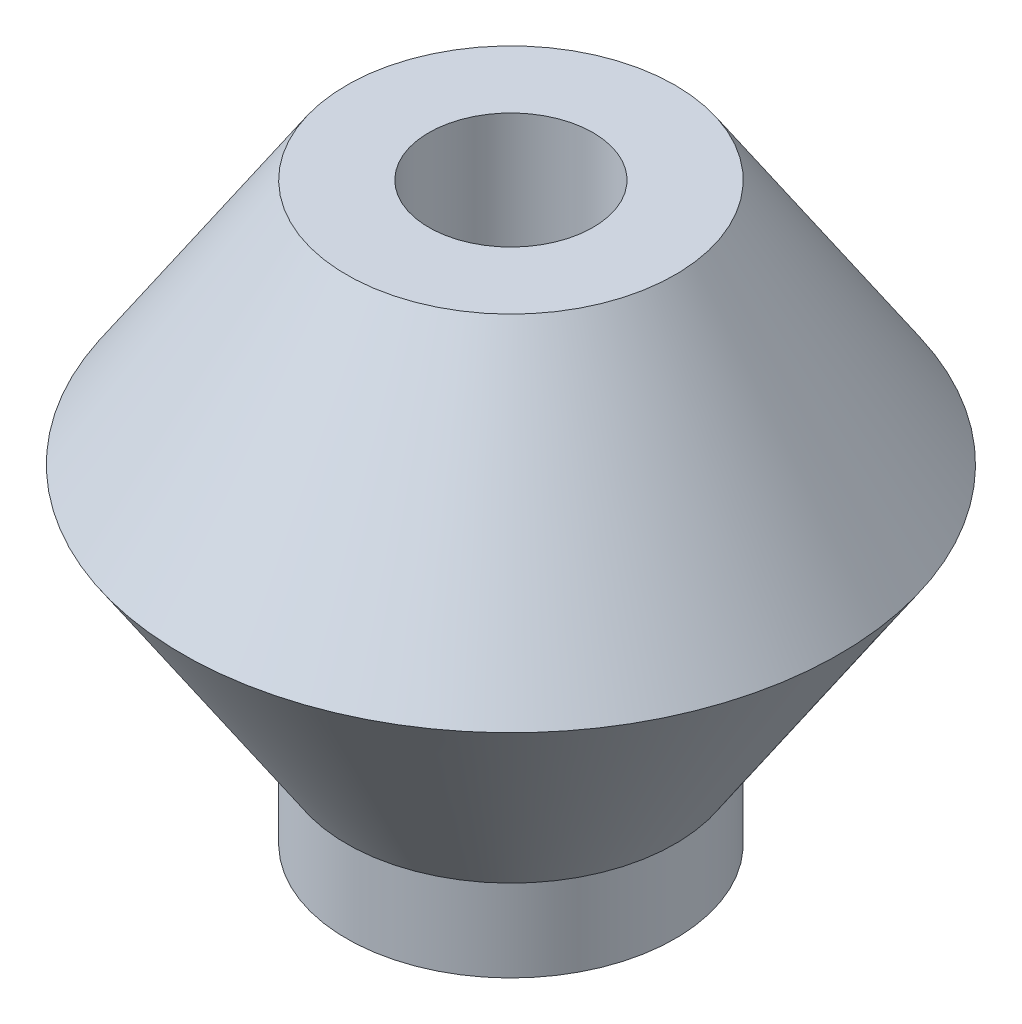
ISO-10303-21;
HEADER;
FILE_DESCRIPTION(('STEP AP214'),'2;1');
FILE_NAME('part.step','',(''),(''),'','','');
FILE_SCHEMA(('AUTOMOTIVE_DESIGN { 1 0 10303 214 1 1 1 1 }'));
ENDSEC;
DATA;
#1=APPLICATION_CONTEXT('core data for automotive mechanical design processes');
#2=APPLICATION_PROTOCOL_DEFINITION('international standard','automotive_design',2000,#1);
#3=PRODUCT_CONTEXT('',#1,'mechanical');
#4=PRODUCT('Part','Part','',(#3));
#5=PRODUCT_RELATED_PRODUCT_CATEGORY('part','',(#4));
#6=PRODUCT_DEFINITION_FORMATION('','',#4);
#7=PRODUCT_DEFINITION_CONTEXT('part definition',#1,'design');
#8=PRODUCT_DEFINITION('design','',#6,#7);
#9=PRODUCT_DEFINITION_SHAPE('','',#8);
#10=(LENGTH_UNIT() NAMED_UNIT(*) SI_UNIT(.MILLI.,.METRE.));
#11=(NAMED_UNIT(*) PLANE_ANGLE_UNIT() SI_UNIT($,.RADIAN.));
#12=(NAMED_UNIT(*) SI_UNIT($,.STERADIAN.) SOLID_ANGLE_UNIT());
#13=UNCERTAINTY_MEASURE_WITH_UNIT(LENGTH_MEASURE(1.E-05),#10,'distance_accuracy_value','');
#14=(GEOMETRIC_REPRESENTATION_CONTEXT(3) GLOBAL_UNCERTAINTY_ASSIGNED_CONTEXT((#13)) GLOBAL_UNIT_ASSIGNED_CONTEXT((#10,
#11,#12)) REPRESENTATION_CONTEXT('',''));
#15=CARTESIAN_POINT('',(0.,0.,0.));
#16=DIRECTION('',(0.,0.,1.));
#17=DIRECTION('',(1.,0.,0.));
#18=AXIS2_PLACEMENT_3D('',#15,#16,#17);
#19=CARTESIAN_POINT('',(4.,0.,0.));
#20=DIRECTION('',(0.,-1.,0.));
#21=DIRECTION('',(0.,0.,-1.));
#22=AXIS2_PLACEMENT_3D('',#19,#20,#21);
#23=PLANE('',#22);
#24=CARTESIAN_POINT('',(0.,0.,0.));
#25=DIRECTION('',(0.,-1.,0.));
#26=DIRECTION('',(0.,0.,-1.));
#27=AXIS2_PLACEMENT_3D('',#24,#25,#26);
#28=CIRCLE('',#27,4.);
#29=CARTESIAN_POINT('',(0.,0.,-4.));
#30=VERTEX_POINT('',#29);
#31=EDGE_CURVE('E53',#30,#30,#28,.T.);
#32=ORIENTED_EDGE('',*,*,#31,.T.);
#33=EDGE_LOOP('',(#32));
#34=FACE_BOUND('',#33,.T.);
#35=CARTESIAN_POINT('',(0.,0.,0.));
#36=DIRECTION('',(0.,-1.,0.));
#37=DIRECTION('',(0.,0.,-1.));
#38=AXIS2_PLACEMENT_3D('',#35,#36,#37);
#39=CIRCLE('',#38,2.);
#40=CARTESIAN_POINT('',(0.,0.,-2.));
#41=VERTEX_POINT('',#40);
#42=EDGE_CURVE('E10',#41,#41,#39,.T.);
#43=ORIENTED_EDGE('',*,*,#42,.F.);
#44=EDGE_LOOP('',(#43));
#45=FACE_BOUND('',#44,.T.);
#46=ADVANCED_FACE('F31',(#34,#45),#23,.T.);
#47=CARTESIAN_POINT('',(0.,0.,0.));
#48=DIRECTION('',(0.,-1.,0.));
#49=DIRECTION('',(0.,0.,-1.));
#50=AXIS2_PLACEMENT_3D('',#47,#48,#49);
#51=CYLINDRICAL_SURFACE('',#50,2.);
#52=ORIENTED_EDGE('',*,*,#42,.T.);
#53=EDGE_LOOP('',(#52));
#54=FACE_BOUND('',#53,.T.);
#55=CARTESIAN_POINT('',(0.,14.,0.));
#56=DIRECTION('',(0.,-1.,0.));
#57=DIRECTION('',(0.,0.,-1.));
#58=AXIS2_PLACEMENT_3D('',#55,#56,#57);
#59=CIRCLE('',#58,2.);
#60=CARTESIAN_POINT('',(0.,14.,-2.));
#61=VERTEX_POINT('',#60);
#62=EDGE_CURVE('E37',#61,#61,#59,.T.);
#63=ORIENTED_EDGE('',*,*,#62,.F.);
#64=EDGE_LOOP('',(#63));
#65=FACE_BOUND('',#64,.T.);
#66=ADVANCED_FACE('F71',(#54,#65),#51,.F.);
#67=CARTESIAN_POINT('',(2.,14.,0.));
#68=DIRECTION('',(0.,1.,0.));
#69=DIRECTION('',(0.,0.,1.));
#70=AXIS2_PLACEMENT_3D('',#67,#68,#69);
#71=PLANE('',#70);
#72=ORIENTED_EDGE('',*,*,#62,.T.);
#73=EDGE_LOOP('',(#72));
#74=FACE_BOUND('',#73,.T.);
#75=CARTESIAN_POINT('',(0.,14.,0.));
#76=DIRECTION('',(0.,-1.,0.));
#77=DIRECTION('',(0.,0.,-1.));
#78=AXIS2_PLACEMENT_3D('',#75,#76,#77);
#79=CIRCLE('',#78,4.);
#80=CARTESIAN_POINT('',(0.,14.,-4.));
#81=VERTEX_POINT('',#80);
#82=EDGE_CURVE('E41',#81,#81,#79,.T.);
#83=ORIENTED_EDGE('',*,*,#82,.F.);
#84=EDGE_LOOP('',(#83));
#85=FACE_BOUND('',#84,.T.);
#86=ADVANCED_FACE('F75',(#74,#85),#71,.T.);
#87=CARTESIAN_POINT('',(0.,8.,0.));
#88=DIRECTION('',(0.,-1.,0.));
#89=DIRECTION('',(0.,0.,-1.));
#90=AXIS2_PLACEMENT_3D('',#87,#88,#89);
#91=CONICAL_SURFACE('',#90,8.,0.588002603547568);
#92=ORIENTED_EDGE('',*,*,#82,.T.);
#93=EDGE_LOOP('',(#92));
#94=FACE_BOUND('',#93,.T.);
#95=CARTESIAN_POINT('',(0.,8.,0.));
#96=DIRECTION('',(0.,-1.,0.));
#97=DIRECTION('',(0.,0.,-1.));
#98=AXIS2_PLACEMENT_3D('',#95,#96,#97);
#99=CIRCLE('',#98,8.);
#100=CARTESIAN_POINT('',(0.,8.,-8.));
#101=VERTEX_POINT('',#100);
#102=EDGE_CURVE('E45',#101,#101,#99,.T.);
#103=ORIENTED_EDGE('',*,*,#102,.F.);
#104=EDGE_LOOP('',(#103));
#105=FACE_BOUND('',#104,.T.);
#106=ADVANCED_FACE('F67',(#94,#105),#91,.T.);
#107=CARTESIAN_POINT('',(0.,2.,0.));
#108=DIRECTION('',(0.,1.,0.));
#109=DIRECTION('',(0.,0.,1.));
#110=AXIS2_PLACEMENT_3D('',#107,#108,#109);
#111=CONICAL_SURFACE('',#110,4.,0.588002603547568);
#112=ORIENTED_EDGE('',*,*,#102,.T.);
#113=EDGE_LOOP('',(#112));
#114=FACE_BOUND('',#113,.T.);
#115=CARTESIAN_POINT('',(0.,2.,0.));
#116=DIRECTION('',(0.,-1.,0.));
#117=DIRECTION('',(0.,0.,-1.));
#118=AXIS2_PLACEMENT_3D('',#115,#116,#117);
#119=CIRCLE('',#118,4.);
#120=CARTESIAN_POINT('',(0.,2.,-4.));
#121=VERTEX_POINT('',#120);
#122=EDGE_CURVE('E50',#121,#121,#119,.T.);
#123=ORIENTED_EDGE('',*,*,#122,.F.);
#124=EDGE_LOOP('',(#123));
#125=FACE_BOUND('',#124,.T.);
#126=ADVANCED_FACE('F61',(#114,#125),#111,.T.);
#127=CARTESIAN_POINT('',(0.,0.,0.));
#128=DIRECTION('',(0.,-1.,0.));
#129=DIRECTION('',(0.,0.,-1.));
#130=AXIS2_PLACEMENT_3D('',#127,#128,#129);
#131=CYLINDRICAL_SURFACE('',#130,4.);
#132=ORIENTED_EDGE('',*,*,#122,.T.);
#133=EDGE_LOOP('',(#132));
#134=FACE_BOUND('',#133,.T.);
#135=ORIENTED_EDGE('',*,*,#31,.F.);
#136=EDGE_LOOP('',(#135));
#137=FACE_BOUND('',#136,.T.);
#138=ADVANCED_FACE('F59',(#134,#137),#131,.T.);
#139=CLOSED_SHELL('',(#46,#66,#86,#106,#126,#138));
#140=MANIFOLD_SOLID_BREP('B2',#139);
#141=ADVANCED_BREP_SHAPE_REPRESENTATION('',(#18,#140),#14);
#142=SHAPE_DEFINITION_REPRESENTATION(#9,#141);
ENDSEC;
END-ISO-10303-21;
